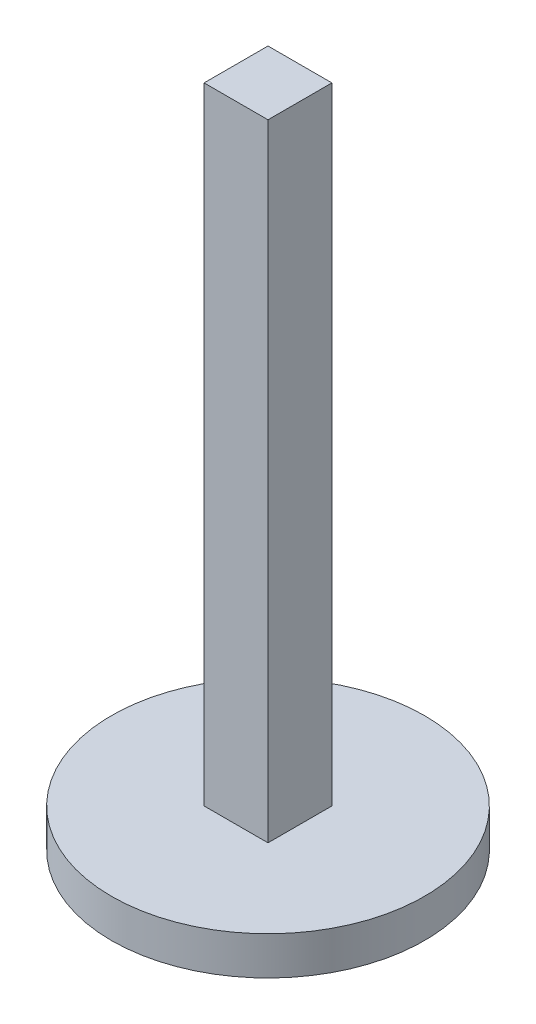
ISO-10303-21;
HEADER;
FILE_DESCRIPTION(('STEP AP214'),'2;1');
FILE_NAME('part.step','',(''),(''),'','','');
FILE_SCHEMA(('AUTOMOTIVE_DESIGN { 1 0 10303 214 1 1 1 1 }'));
ENDSEC;
DATA;
#1=APPLICATION_CONTEXT('core data for automotive mechanical design processes');
#2=APPLICATION_PROTOCOL_DEFINITION('international standard','automotive_design',2000,#1);
#3=PRODUCT_CONTEXT('',#1,'mechanical');
#4=PRODUCT('Part','Part','',(#3));
#5=PRODUCT_RELATED_PRODUCT_CATEGORY('part','',(#4));
#6=PRODUCT_DEFINITION_FORMATION('','',#4);
#7=PRODUCT_DEFINITION_CONTEXT('part definition',#1,'design');
#8=PRODUCT_DEFINITION('design','',#6,#7);
#9=PRODUCT_DEFINITION_SHAPE('','',#8);
#10=(LENGTH_UNIT() NAMED_UNIT(*) SI_UNIT(.MILLI.,.METRE.));
#11=(NAMED_UNIT(*) PLANE_ANGLE_UNIT() SI_UNIT($,.RADIAN.));
#12=(NAMED_UNIT(*) SI_UNIT($,.STERADIAN.) SOLID_ANGLE_UNIT());
#13=UNCERTAINTY_MEASURE_WITH_UNIT(LENGTH_MEASURE(1.E-05),#10,'distance_accuracy_value','');
#14=(GEOMETRIC_REPRESENTATION_CONTEXT(3) GLOBAL_UNCERTAINTY_ASSIGNED_CONTEXT((#13)) GLOBAL_UNIT_ASSIGNED_CONTEXT((#10,
#11,#12)) REPRESENTATION_CONTEXT('',''));
#15=CARTESIAN_POINT('',(0.,0.,0.));
#16=DIRECTION('',(0.,0.,1.));
#17=DIRECTION('',(1.,0.,0.));
#18=AXIS2_PLACEMENT_3D('',#15,#16,#17);
#19=CARTESIAN_POINT('',(0.,1.5,0.));
#20=DIRECTION('',(0.,1.,0.));
#21=DIRECTION('',(0.,0.,1.));
#22=AXIS2_PLACEMENT_3D('',#19,#20,#21);
#23=PLANE('',#22);
#24=CARTESIAN_POINT('',(0.,1.5,0.));
#25=DIRECTION('',(0.,1.,0.));
#26=DIRECTION('',(0.,0.,1.));
#27=AXIS2_PLACEMENT_3D('',#24,#25,#26);
#28=CIRCLE('',#27,6.125);
#29=CARTESIAN_POINT('',(0.,1.5,6.125));
#30=VERTEX_POINT('',#29);
#31=EDGE_CURVE('E11',#30,#30,#28,.T.);
#32=ORIENTED_EDGE('',*,*,#31,.T.);
#33=EDGE_LOOP('',(#32));
#34=FACE_BOUND('',#33,.T.);
#35=DIRECTION('',(-1.,0.,0.));
#36=VECTOR('',#35,1.);
#37=CARTESIAN_POINT('',(-1.25,1.5,-1.25));
#38=LINE('',#37,#36);
#39=CARTESIAN_POINT('',(1.25,1.5,-1.25));
#40=VERTEX_POINT('',#39);
#41=CARTESIAN_POINT('',(-1.25,1.5,-1.25));
#42=VERTEX_POINT('',#41);
#43=EDGE_CURVE('E109',#40,#42,#38,.T.);
#44=ORIENTED_EDGE('',*,*,#43,.F.);
#45=DIRECTION('',(0.,0.,-1.));
#46=VECTOR('',#45,1.);
#47=CARTESIAN_POINT('',(1.25,1.5,1.25));
#48=LINE('',#47,#46);
#49=CARTESIAN_POINT('',(1.25,1.5,1.25));
#50=VERTEX_POINT('',#49);
#51=EDGE_CURVE('E55',#50,#40,#48,.T.);
#52=ORIENTED_EDGE('',*,*,#51,.F.);
#53=DIRECTION('',(1.,0.,0.));
#54=VECTOR('',#53,1.);
#55=CARTESIAN_POINT('',(-1.25,1.5,1.25));
#56=LINE('',#55,#54);
#57=CARTESIAN_POINT('',(-1.25,1.50000000000001,1.25));
#58=VERTEX_POINT('',#57);
#59=EDGE_CURVE('E104',#58,#50,#56,.T.);
#60=ORIENTED_EDGE('',*,*,#59,.F.);
#61=DIRECTION('',(0.,0.,1.));
#62=VECTOR('',#61,1.);
#63=CARTESIAN_POINT('',(-1.25,1.5,1.25));
#64=LINE('',#63,#62);
#65=EDGE_CURVE('E60',#42,#58,#64,.T.);
#66=ORIENTED_EDGE('',*,*,#65,.F.);
#67=EDGE_LOOP('',(#44,#52,#60,#66));
#68=FACE_BOUND('',#67,.T.);
#69=ADVANCED_FACE('F39',(#34,#68),#23,.T.);
#70=CARTESIAN_POINT('',(0.,0.,0.));
#71=DIRECTION('',(0.,1.,0.));
#72=DIRECTION('',(0.,0.,1.));
#73=AXIS2_PLACEMENT_3D('',#70,#71,#72);
#74=PLANE('',#73);
#75=CARTESIAN_POINT('',(0.,0.,0.));
#76=DIRECTION('',(0.,1.,0.));
#77=DIRECTION('',(0.,0.,1.));
#78=AXIS2_PLACEMENT_3D('',#75,#76,#77);
#79=CIRCLE('',#78,6.125);
#80=CARTESIAN_POINT('',(0.,0.,6.125));
#81=VERTEX_POINT('',#80);
#82=EDGE_CURVE('E43',#81,#81,#79,.T.);
#83=ORIENTED_EDGE('',*,*,#82,.F.);
#84=EDGE_LOOP('',(#83));
#85=FACE_BOUND('',#84,.T.);
#86=ADVANCED_FACE('F125',(#85),#74,.F.);
#87=CARTESIAN_POINT('',(0.,1.5,0.));
#88=DIRECTION('',(0.,-1.,0.));
#89=DIRECTION('',(0.,0.,-1.));
#90=AXIS2_PLACEMENT_3D('',#87,#88,#89);
#91=CYLINDRICAL_SURFACE('',#90,6.125);
#92=ORIENTED_EDGE('',*,*,#31,.F.);
#93=EDGE_LOOP('',(#92));
#94=FACE_BOUND('',#93,.T.);
#95=ORIENTED_EDGE('',*,*,#82,.T.);
#96=EDGE_LOOP('',(#95));
#97=FACE_BOUND('',#96,.T.);
#98=ADVANCED_FACE('F41',(#94,#97),#91,.T.);
#99=CARTESIAN_POINT('',(-1.25,26.,1.25));
#100=DIRECTION('',(0.,0.,-1.));
#101=DIRECTION('',(-1.,0.,0.));
#102=AXIS2_PLACEMENT_3D('',#99,#100,#101);
#103=PLANE('',#102);
#104=ORIENTED_EDGE('',*,*,#59,.T.);
#105=DIRECTION('',(0.,-1.,0.));
#106=VECTOR('',#105,1.);
#107=CARTESIAN_POINT('',(1.25,26.,1.25));
#108=LINE('',#107,#106);
#109=CARTESIAN_POINT('',(1.25,26.,1.25));
#110=VERTEX_POINT('',#109);
#111=EDGE_CURVE('E84',#110,#50,#108,.T.);
#112=ORIENTED_EDGE('',*,*,#111,.F.);
#113=DIRECTION('',(1.,0.,0.));
#114=VECTOR('',#113,1.);
#115=CARTESIAN_POINT('',(-1.25,26.,1.25));
#116=LINE('',#115,#114);
#117=CARTESIAN_POINT('',(-1.25,26.,1.25));
#118=VERTEX_POINT('',#117);
#119=EDGE_CURVE('E92',#118,#110,#116,.T.);
#120=ORIENTED_EDGE('',*,*,#119,.F.);
#121=DIRECTION('',(0.,-1.,0.));
#122=VECTOR('',#121,1.);
#123=CARTESIAN_POINT('',(-1.25,26.,1.25));
#124=LINE('',#123,#122);
#125=EDGE_CURVE('E199',#118,#58,#124,.T.);
#126=ORIENTED_EDGE('',*,*,#125,.T.);
#127=EDGE_LOOP('',(#104,#112,#120,#126));
#128=FACE_BOUND('',#127,.T.);
#129=ADVANCED_FACE('F103',(#128),#103,.F.);
#130=CARTESIAN_POINT('',(1.25,26.,1.25));
#131=DIRECTION('',(-1.,0.,0.));
#132=DIRECTION('',(0.,0.,1.));
#133=AXIS2_PLACEMENT_3D('',#130,#131,#132);
#134=PLANE('',#133);
#135=ORIENTED_EDGE('',*,*,#51,.T.);
#136=DIRECTION('',(0.,-1.,0.));
#137=VECTOR('',#136,1.);
#138=CARTESIAN_POINT('',(1.25,26.,-1.25));
#139=LINE('',#138,#137);
#140=CARTESIAN_POINT('',(1.25,26.,-1.25));
#141=VERTEX_POINT('',#140);
#142=EDGE_CURVE('E86',#141,#40,#139,.T.);
#143=ORIENTED_EDGE('',*,*,#142,.F.);
#144=DIRECTION('',(0.,0.,-1.));
#145=VECTOR('',#144,1.);
#146=CARTESIAN_POINT('',(1.25,26.,1.25));
#147=LINE('',#146,#145);
#148=EDGE_CURVE('E80',#110,#141,#147,.T.);
#149=ORIENTED_EDGE('',*,*,#148,.F.);
#150=ORIENTED_EDGE('',*,*,#111,.T.);
#151=EDGE_LOOP('',(#135,#143,#149,#150));
#152=FACE_BOUND('',#151,.T.);
#153=ADVANCED_FACE('F82',(#152),#134,.F.);
#154=CARTESIAN_POINT('',(-1.25,26.,-1.25));
#155=DIRECTION('',(0.,0.,-1.));
#156=DIRECTION('',(-1.,0.,0.));
#157=AXIS2_PLACEMENT_3D('',#154,#155,#156);
#158=PLANE('',#157);
#159=ORIENTED_EDGE('',*,*,#142,.T.);
#160=ORIENTED_EDGE('',*,*,#43,.T.);
#161=DIRECTION('',(0.,-1.,0.));
#162=VECTOR('',#161,1.);
#163=CARTESIAN_POINT('',(-1.25,26.,-1.25));
#164=LINE('',#163,#162);
#165=CARTESIAN_POINT('',(-1.25,26.,-1.25));
#166=VERTEX_POINT('',#165);
#167=EDGE_CURVE('E111',#166,#42,#164,.T.);
#168=ORIENTED_EDGE('',*,*,#167,.F.);
#169=DIRECTION('',(1.,0.,0.));
#170=VECTOR('',#169,1.);
#171=CARTESIAN_POINT('',(-1.25,26.,-1.25));
#172=LINE('',#171,#170);
#173=EDGE_CURVE('E91',#166,#141,#172,.T.);
#174=ORIENTED_EDGE('',*,*,#173,.T.);
#175=EDGE_LOOP('',(#159,#160,#168,#174));
#176=FACE_BOUND('',#175,.T.);
#177=ADVANCED_FACE('F139',(#176),#158,.T.);
#178=CARTESIAN_POINT('',(-1.25,26.,1.25));
#179=DIRECTION('',(-1.,0.,0.));
#180=DIRECTION('',(0.,0.,1.));
#181=AXIS2_PLACEMENT_3D('',#178,#179,#180);
#182=PLANE('',#181);
#183=ORIENTED_EDGE('',*,*,#167,.T.);
#184=ORIENTED_EDGE('',*,*,#65,.T.);
#185=ORIENTED_EDGE('',*,*,#125,.F.);
#186=DIRECTION('',(0.,0.,-1.));
#187=VECTOR('',#186,1.);
#188=CARTESIAN_POINT('',(-1.25,26.,1.25));
#189=LINE('',#188,#187);
#190=EDGE_CURVE('E98',#118,#166,#189,.T.);
#191=ORIENTED_EDGE('',*,*,#190,.T.);
#192=EDGE_LOOP('',(#183,#184,#185,#191));
#193=FACE_BOUND('',#192,.T.);
#194=ADVANCED_FACE('F142',(#193),#182,.T.);
#195=CARTESIAN_POINT('',(0.,26.,0.));
#196=DIRECTION('',(0.,1.,0.));
#197=DIRECTION('',(0.,0.,1.));
#198=AXIS2_PLACEMENT_3D('',#195,#196,#197);
#199=PLANE('',#198);
#200=ORIENTED_EDGE('',*,*,#119,.T.);
#201=ORIENTED_EDGE('',*,*,#148,.T.);
#202=ORIENTED_EDGE('',*,*,#173,.F.);
#203=ORIENTED_EDGE('',*,*,#190,.F.);
#204=EDGE_LOOP('',(#200,#201,#202,#203));
#205=FACE_BOUND('',#204,.T.);
#206=ADVANCED_FACE('F96',(#205),#199,.T.);
#207=CLOSED_SHELL('',(#69,#86,#98,#129,#153,#177,#194,#206));
#208=MANIFOLD_SOLID_BREP('B2',#207);
#209=ADVANCED_BREP_SHAPE_REPRESENTATION('',(#18,#208),#14);
#210=SHAPE_DEFINITION_REPRESENTATION(#9,#209);
ENDSEC;
END-ISO-10303-21;
